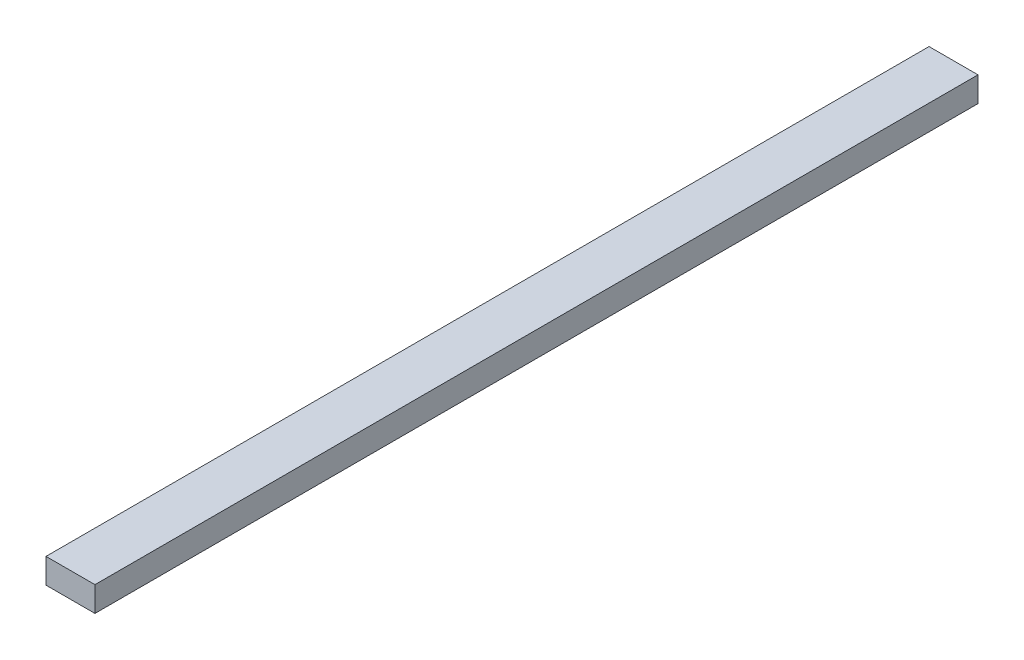
ISO-10303-21;
HEADER;
FILE_DESCRIPTION(('STEP AP214'),'2;1');
FILE_NAME('part.step','',(''),(''),'','','');
FILE_SCHEMA(('AUTOMOTIVE_DESIGN { 1 0 10303 214 1 1 1 1 }'));
ENDSEC;
DATA;
#1=APPLICATION_CONTEXT('core data for automotive mechanical design processes');
#2=APPLICATION_PROTOCOL_DEFINITION('international standard','automotive_design',2000,#1);
#3=PRODUCT_CONTEXT('',#1,'mechanical');
#4=PRODUCT('Part','Part','',(#3));
#5=PRODUCT_RELATED_PRODUCT_CATEGORY('part','',(#4));
#6=PRODUCT_DEFINITION_FORMATION('','',#4);
#7=PRODUCT_DEFINITION_CONTEXT('part definition',#1,'design');
#8=PRODUCT_DEFINITION('design','',#6,#7);
#9=PRODUCT_DEFINITION_SHAPE('','',#8);
#10=(LENGTH_UNIT() NAMED_UNIT(*) SI_UNIT(.MILLI.,.METRE.));
#11=(NAMED_UNIT(*) PLANE_ANGLE_UNIT() SI_UNIT($,.RADIAN.));
#12=(NAMED_UNIT(*) SI_UNIT($,.STERADIAN.) SOLID_ANGLE_UNIT());
#13=UNCERTAINTY_MEASURE_WITH_UNIT(LENGTH_MEASURE(1.E-05),#10,'distance_accuracy_value','');
#14=(GEOMETRIC_REPRESENTATION_CONTEXT(3) GLOBAL_UNCERTAINTY_ASSIGNED_CONTEXT((#13)) GLOBAL_UNIT_ASSIGNED_CONTEXT((#10,
#11,#12)) REPRESENTATION_CONTEXT('',''));
#15=CARTESIAN_POINT('',(0.,0.,0.));
#16=DIRECTION('',(0.,0.,1.));
#17=DIRECTION('',(1.,0.,0.));
#18=AXIS2_PLACEMENT_3D('',#15,#16,#17);
#19=CARTESIAN_POINT('',(-84.1621804374241,15.9452575941677,-234.95));
#20=DIRECTION('',(1.,0.,0.));
#21=DIRECTION('',(0.,0.,-1.));
#22=AXIS2_PLACEMENT_3D('',#19,#20,#21);
#23=PLANE('',#22);
#24=DIRECTION('',(0.,1.,0.));
#25=VECTOR('',#24,1.);
#26=CARTESIAN_POINT('',(-84.1621804374241,15.9452575941677,0.));
#27=LINE('',#26,#25);
#28=CARTESIAN_POINT('',(-84.1621804374241,15.9452575941677,0.));
#29=VERTEX_POINT('',#28);
#30=CARTESIAN_POINT('',(-84.1621804374241,19.2472575941677,0.));
#31=VERTEX_POINT('',#30);
#32=EDGE_CURVE('E57',#29,#31,#27,.T.);
#33=ORIENTED_EDGE('',*,*,#32,.F.);
#34=DIRECTION('',(0.,0.,1.));
#35=VECTOR('',#34,1.);
#36=CARTESIAN_POINT('',(-84.1621804374241,15.9452575941677,-234.95));
#37=LINE('',#36,#35);
#38=CARTESIAN_POINT('',(-84.1621804374241,15.9452575941677,-116.84));
#39=VERTEX_POINT('',#38);
#40=EDGE_CURVE('E32',#39,#29,#37,.T.);
#41=ORIENTED_EDGE('',*,*,#40,.F.);
#42=DIRECTION('',(0.,1.,0.));
#43=VECTOR('',#42,1.);
#44=CARTESIAN_POINT('',(-84.1621804374241,15.9452575941677,-116.84));
#45=LINE('',#44,#43);
#46=CARTESIAN_POINT('',(-84.1621804374241,19.2472575941677,-116.84));
#47=VERTEX_POINT('',#46);
#48=EDGE_CURVE('E59',#39,#47,#45,.T.);
#49=ORIENTED_EDGE('',*,*,#48,.T.);
#50=DIRECTION('',(0.,0.,1.));
#51=VECTOR('',#50,1.);
#52=CARTESIAN_POINT('',(-84.1621804374241,19.2472575941677,-234.95));
#53=LINE('',#52,#51);
#54=EDGE_CURVE('E9',#47,#31,#53,.T.);
#55=ORIENTED_EDGE('',*,*,#54,.T.);
#56=EDGE_LOOP('',(#33,#41,#49,#55));
#57=FACE_BOUND('',#56,.T.);
#58=ADVANCED_FACE('F15',(#57),#23,.T.);
#59=CARTESIAN_POINT('',(-84.1621804374241,19.2472575941677,-234.95));
#60=DIRECTION('',(0.,1.,0.));
#61=DIRECTION('',(0.,0.,1.));
#62=AXIS2_PLACEMENT_3D('',#59,#60,#61);
#63=PLANE('',#62);
#64=DIRECTION('',(-1.,0.,0.));
#65=VECTOR('',#64,1.);
#66=CARTESIAN_POINT('',(-84.1621804374241,19.2472575941677,0.));
#67=LINE('',#66,#65);
#68=CARTESIAN_POINT('',(-90.6391804374241,19.2472575941677,0.));
#69=VERTEX_POINT('',#68);
#70=EDGE_CURVE('E64',#31,#69,#67,.T.);
#71=ORIENTED_EDGE('',*,*,#70,.F.);
#72=ORIENTED_EDGE('',*,*,#54,.F.);
#73=DIRECTION('',(-1.,0.,0.));
#74=VECTOR('',#73,1.);
#75=CARTESIAN_POINT('',(-84.1621804374241,19.2472575941677,-116.84));
#76=LINE('',#75,#74);
#77=CARTESIAN_POINT('',(-90.6391804374241,19.2472575941677,-116.84));
#78=VERTEX_POINT('',#77);
#79=EDGE_CURVE('E86',#47,#78,#76,.T.);
#80=ORIENTED_EDGE('',*,*,#79,.T.);
#81=DIRECTION('',(0.,0.,1.));
#82=VECTOR('',#81,1.);
#83=CARTESIAN_POINT('',(-90.6391804374241,19.2472575941677,-234.95));
#84=LINE('',#83,#82);
#85=EDGE_CURVE('E24',#78,#69,#84,.T.);
#86=ORIENTED_EDGE('',*,*,#85,.T.);
#87=EDGE_LOOP('',(#71,#72,#80,#86));
#88=FACE_BOUND('',#87,.T.);
#89=ADVANCED_FACE('F65',(#88),#63,.T.);
#90=CARTESIAN_POINT('',(-90.6391804374241,19.2472575941677,-234.95));
#91=DIRECTION('',(-1.,0.,0.));
#92=DIRECTION('',(0.,0.,1.));
#93=AXIS2_PLACEMENT_3D('',#90,#91,#92);
#94=PLANE('',#93);
#95=DIRECTION('',(0.,-1.,0.));
#96=VECTOR('',#95,1.);
#97=CARTESIAN_POINT('',(-90.6391804374241,19.2472575941677,0.));
#98=LINE('',#97,#96);
#99=CARTESIAN_POINT('',(-90.6391804374241,15.9452575941677,0.));
#100=VERTEX_POINT('',#99);
#101=EDGE_CURVE('E70',#69,#100,#98,.T.);
#102=ORIENTED_EDGE('',*,*,#101,.F.);
#103=ORIENTED_EDGE('',*,*,#85,.F.);
#104=DIRECTION('',(0.,-1.,0.));
#105=VECTOR('',#104,1.);
#106=CARTESIAN_POINT('',(-90.6391804374241,19.2472575941677,-116.84));
#107=LINE('',#106,#105);
#108=CARTESIAN_POINT('',(-90.6391804374241,15.9452575941677,-116.84));
#109=VERTEX_POINT('',#108);
#110=EDGE_CURVE('E87',#78,#109,#107,.T.);
#111=ORIENTED_EDGE('',*,*,#110,.T.);
#112=DIRECTION('',(0.,0.,1.));
#113=VECTOR('',#112,1.);
#114=CARTESIAN_POINT('',(-90.6391804374241,15.9452575941677,-234.95));
#115=LINE('',#114,#113);
#116=EDGE_CURVE('E39',#109,#100,#115,.T.);
#117=ORIENTED_EDGE('',*,*,#116,.T.);
#118=EDGE_LOOP('',(#102,#103,#111,#117));
#119=FACE_BOUND('',#118,.T.);
#120=ADVANCED_FACE('F100',(#119),#94,.T.);
#121=CARTESIAN_POINT('',(-90.6391804374241,15.9452575941677,-234.95));
#122=DIRECTION('',(0.,-1.,0.));
#123=DIRECTION('',(0.,0.,-1.));
#124=AXIS2_PLACEMENT_3D('',#121,#122,#123);
#125=PLANE('',#124);
#126=DIRECTION('',(1.,0.,0.));
#127=VECTOR('',#126,1.);
#128=CARTESIAN_POINT('',(-90.6391804374241,15.9452575941677,0.));
#129=LINE('',#128,#127);
#130=EDGE_CURVE('E74',#100,#29,#129,.T.);
#131=ORIENTED_EDGE('',*,*,#130,.F.);
#132=ORIENTED_EDGE('',*,*,#116,.F.);
#133=DIRECTION('',(1.,0.,0.));
#134=VECTOR('',#133,1.);
#135=CARTESIAN_POINT('',(-90.6391804374241,15.9452575941677,-116.84));
#136=LINE('',#135,#134);
#137=EDGE_CURVE('E19',#109,#39,#136,.T.);
#138=ORIENTED_EDGE('',*,*,#137,.T.);
#139=ORIENTED_EDGE('',*,*,#40,.T.);
#140=EDGE_LOOP('',(#131,#132,#138,#139));
#141=FACE_BOUND('',#140,.T.);
#142=ADVANCED_FACE('F91',(#141),#125,.T.);
#143=CARTESIAN_POINT('',(0.,0.,-116.84));
#144=DIRECTION('',(0.,0.,1.));
#145=DIRECTION('',(1.,0.,0.));
#146=AXIS2_PLACEMENT_3D('',#143,#144,#145);
#147=PLANE('',#146);
#148=ORIENTED_EDGE('',*,*,#48,.F.);
#149=ORIENTED_EDGE('',*,*,#137,.F.);
#150=ORIENTED_EDGE('',*,*,#110,.F.);
#151=ORIENTED_EDGE('',*,*,#79,.F.);
#152=EDGE_LOOP('',(#148,#149,#150,#151));
#153=FACE_BOUND('',#152,.T.);
#154=ADVANCED_FACE('F17',(#153),#147,.F.);
#155=CARTESIAN_POINT('',(0.,0.,0.));
#156=DIRECTION('',(0.,0.,1.));
#157=DIRECTION('',(1.,0.,0.));
#158=AXIS2_PLACEMENT_3D('',#155,#156,#157);
#159=PLANE('',#158);
#160=ORIENTED_EDGE('',*,*,#32,.T.);
#161=ORIENTED_EDGE('',*,*,#70,.T.);
#162=ORIENTED_EDGE('',*,*,#101,.T.);
#163=ORIENTED_EDGE('',*,*,#130,.T.);
#164=EDGE_LOOP('',(#160,#161,#162,#163));
#165=FACE_BOUND('',#164,.T.);
#166=ADVANCED_FACE('F73',(#165),#159,.T.);
#167=CLOSED_SHELL('',(#58,#89,#120,#142,#154,#166));
#168=MANIFOLD_SOLID_BREP('B1',#167);
#169=ADVANCED_BREP_SHAPE_REPRESENTATION('',(#18,#168),#14);
#170=SHAPE_DEFINITION_REPRESENTATION(#9,#169);
ENDSEC;
END-ISO-10303-21;
